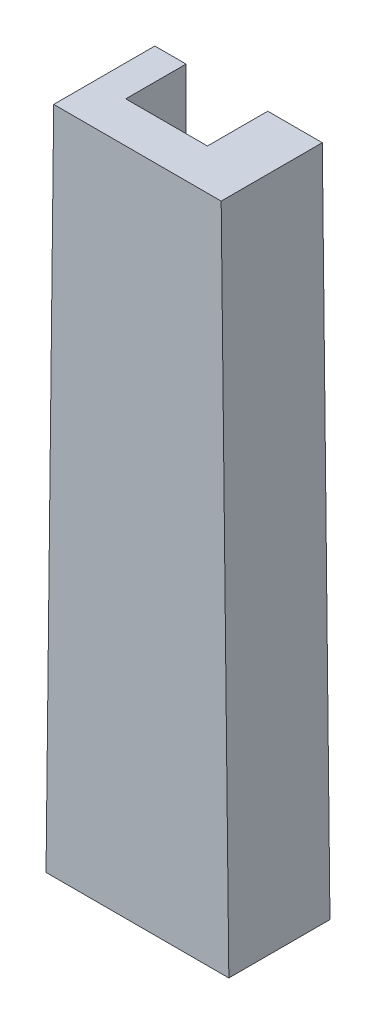
ISO-10303-21;
HEADER;
FILE_DESCRIPTION(('STEP AP214'),'2;1');
FILE_NAME('part.step','',(''),(''),'','','');
FILE_SCHEMA(('AUTOMOTIVE_DESIGN { 1 0 10303 214 1 1 1 1 }'));
ENDSEC;
DATA;
#1=APPLICATION_CONTEXT('core data for automotive mechanical design processes');
#2=APPLICATION_PROTOCOL_DEFINITION('international standard','automotive_design',2000,#1);
#3=PRODUCT_CONTEXT('',#1,'mechanical');
#4=PRODUCT('Part','Part','',(#3));
#5=PRODUCT_RELATED_PRODUCT_CATEGORY('part','',(#4));
#6=PRODUCT_DEFINITION_FORMATION('','',#4);
#7=PRODUCT_DEFINITION_CONTEXT('part definition',#1,'design');
#8=PRODUCT_DEFINITION('design','',#6,#7);
#9=PRODUCT_DEFINITION_SHAPE('','',#8);
#10=(LENGTH_UNIT() NAMED_UNIT(*) SI_UNIT(.MILLI.,.METRE.));
#11=(NAMED_UNIT(*) PLANE_ANGLE_UNIT() SI_UNIT($,.RADIAN.));
#12=(NAMED_UNIT(*) SI_UNIT($,.STERADIAN.) SOLID_ANGLE_UNIT());
#13=UNCERTAINTY_MEASURE_WITH_UNIT(LENGTH_MEASURE(1.E-05),#10,'distance_accuracy_value','');
#14=(GEOMETRIC_REPRESENTATION_CONTEXT(3) GLOBAL_UNCERTAINTY_ASSIGNED_CONTEXT((#13)) GLOBAL_UNIT_ASSIGNED_CONTEXT((#10,
#11,#12)) REPRESENTATION_CONTEXT('',''));
#15=CARTESIAN_POINT('',(0.,0.,0.));
#16=DIRECTION('',(0.,0.,1.));
#17=DIRECTION('',(1.,0.,0.));
#18=AXIS2_PLACEMENT_3D('',#15,#16,#17);
#19=CARTESIAN_POINT('',(0.,86.,0.));
#20=DIRECTION('',(0.,-1.,0.));
#21=DIRECTION('',(0.,0.,-1.));
#22=AXIS2_PLACEMENT_3D('',#19,#20,#21);
#23=PLANE('',#22);
#24=DIRECTION('',(-1.,0.,0.));
#25=VECTOR('',#24,1.);
#26=CARTESIAN_POINT('',(-10.9033495145631,86.,-0.383495145631064));
#27=LINE('',#26,#25);
#28=CARTESIAN_POINT('',(10.6266504854369,86.,-0.383495145631066));
#29=VERTEX_POINT('',#28);
#30=CARTESIAN_POINT('',(3.61165048543689,86.,-0.383495145631066));
#31=VERTEX_POINT('',#30);
#32=EDGE_CURVE('E47',#29,#31,#27,.T.);
#33=ORIENTED_EDGE('',*,*,#32,.T.);
#34=DIRECTION('',(0.,0.,-1.));
#35=VECTOR('',#34,1.);
#36=CARTESIAN_POINT('',(3.61165048543689,86.,7.36926663340781));
#37=LINE('',#36,#35);
#38=CARTESIAN_POINT('',(3.61165048543689,86.,7.36926663340781));
#39=VERTEX_POINT('',#38);
#40=EDGE_CURVE('E127',#39,#31,#37,.T.);
#41=ORIENTED_EDGE('',*,*,#40,.F.);
#42=DIRECTION('',(1.,0.,0.));
#43=VECTOR('',#42,1.);
#44=CARTESIAN_POINT('',(-6.88834951456311,86.,7.36926663340781));
#45=LINE('',#44,#43);
#46=CARTESIAN_POINT('',(-6.88834951456311,86.,7.36926663340781));
#47=VERTEX_POINT('',#46);
#48=EDGE_CURVE('E145',#47,#39,#45,.T.);
#49=ORIENTED_EDGE('',*,*,#48,.F.);
#50=DIRECTION('',(0.,0.,1.));
#51=VECTOR('',#50,1.);
#52=CARTESIAN_POINT('',(-6.88834951456311,86.,-0.383495145631066));
#53=LINE('',#52,#51);
#54=CARTESIAN_POINT('',(-6.88834951456311,86.,-0.383495145631066));
#55=VERTEX_POINT('',#54);
#56=EDGE_CURVE('E143',#55,#47,#53,.T.);
#57=ORIENTED_EDGE('',*,*,#56,.F.);
#58=CARTESIAN_POINT('',(-10.9033495145631,86.,-0.383495145631064));
#59=VERTEX_POINT('',#58);
#60=EDGE_CURVE('E132',#55,#59,#27,.T.);
#61=ORIENTED_EDGE('',*,*,#60,.T.);
#62=DIRECTION('',(0.,0.,1.));
#63=VECTOR('',#62,1.);
#64=CARTESIAN_POINT('',(-10.9033495145631,86.,12.6165048543689));
#65=LINE('',#64,#63);
#66=CARTESIAN_POINT('',(-10.9033495145631,86.,12.6165048543689));
#67=VERTEX_POINT('',#66);
#68=EDGE_CURVE('E149',#59,#67,#65,.T.);
#69=ORIENTED_EDGE('',*,*,#68,.T.);
#70=DIRECTION('',(1.,0.,0.));
#71=VECTOR('',#70,1.);
#72=CARTESIAN_POINT('',(10.6266504854369,86.,12.6165048543689));
#73=LINE('',#72,#71);
#74=CARTESIAN_POINT('',(10.6266504854369,86.,12.6165048543689));
#75=VERTEX_POINT('',#74);
#76=EDGE_CURVE('E169',#67,#75,#73,.T.);
#77=ORIENTED_EDGE('',*,*,#76,.T.);
#78=DIRECTION('',(0.,0.,-1.));
#79=VECTOR('',#78,1.);
#80=CARTESIAN_POINT('',(10.6266504854369,86.,-0.383495145631066));
#81=LINE('',#80,#79);
#82=EDGE_CURVE('E12',#75,#29,#81,.T.);
#83=ORIENTED_EDGE('',*,*,#82,.T.);
#84=EDGE_LOOP('',(#33,#41,#49,#57,#61,#69,#77,#83));
#85=FACE_BOUND('',#84,.T.);
#86=ADVANCED_FACE('F43',(#85),#23,.F.);
#87=CARTESIAN_POINT('',(0.,0.,0.));
#88=DIRECTION('',(0.,1.,0.));
#89=DIRECTION('',(0.,0.,1.));
#90=AXIS2_PLACEMENT_3D('',#87,#88,#89);
#91=PLANE('',#90);
#92=DIRECTION('',(0.,0.,1.));
#93=VECTOR('',#92,1.);
#94=CARTESIAN_POINT('',(-11.8883495145631,0.,-0.383495145631062));
#95=LINE('',#94,#93);
#96=CARTESIAN_POINT('',(-11.8883495145631,0.,-0.383495145631062));
#97=VERTEX_POINT('',#96);
#98=CARTESIAN_POINT('',(-11.8883495145631,0.,12.6165048543689));
#99=VERTEX_POINT('',#98);
#100=EDGE_CURVE('E208',#97,#99,#95,.T.);
#101=ORIENTED_EDGE('',*,*,#100,.F.);
#102=DIRECTION('',(-1.,0.,0.));
#103=VECTOR('',#102,1.);
#104=CARTESIAN_POINT('',(11.6116504854369,0.,-0.383495145631064));
#105=LINE('',#104,#103);
#106=CARTESIAN_POINT('',(11.6116504854369,0.,-0.383495145631064));
#107=VERTEX_POINT('',#106);
#108=EDGE_CURVE('E252',#107,#97,#105,.T.);
#109=ORIENTED_EDGE('',*,*,#108,.F.);
#110=DIRECTION('',(0.,0.,-1.));
#111=VECTOR('',#110,1.);
#112=CARTESIAN_POINT('',(11.6116504854369,0.,12.6165048543689));
#113=LINE('',#112,#111);
#114=CARTESIAN_POINT('',(11.6116504854369,0.,12.6165048543689));
#115=VERTEX_POINT('',#114);
#116=EDGE_CURVE('E188',#115,#107,#113,.T.);
#117=ORIENTED_EDGE('',*,*,#116,.F.);
#118=DIRECTION('',(1.,0.,0.));
#119=VECTOR('',#118,1.);
#120=CARTESIAN_POINT('',(-11.8883495145631,0.,12.6165048543689));
#121=LINE('',#120,#119);
#122=EDGE_CURVE('E285',#99,#115,#121,.T.);
#123=ORIENTED_EDGE('',*,*,#122,.F.);
#124=EDGE_LOOP('',(#101,#109,#117,#123));
#125=FACE_BOUND('',#124,.T.);
#126=ADVANCED_FACE('F264',(#125),#91,.F.);
#127=CARTESIAN_POINT('',(0.,0.,12.6165048543689));
#128=DIRECTION('',(0.,0.,-1.));
#129=DIRECTION('',(-1.,0.,0.));
#130=AXIS2_PLACEMENT_3D('',#127,#128,#129);
#131=PLANE('',#130);
#132=DIRECTION('',(-0.0114527371979749,0.999934415254658,0.));
#133=VECTOR('',#132,1.);
#134=CARTESIAN_POINT('',(11.6116504854369,0.,12.6165048543689));
#135=LINE('',#134,#133);
#136=EDGE_CURVE('E68',#115,#75,#135,.T.);
#137=ORIENTED_EDGE('',*,*,#136,.T.);
#138=ORIENTED_EDGE('',*,*,#76,.F.);
#139=DIRECTION('',(0.0114527371979749,0.999934415254658,0.));
#140=VECTOR('',#139,1.);
#141=CARTESIAN_POINT('',(-11.8883495145631,0.,12.6165048543689));
#142=LINE('',#141,#140);
#143=EDGE_CURVE('E190',#99,#67,#142,.T.);
#144=ORIENTED_EDGE('',*,*,#143,.F.);
#145=ORIENTED_EDGE('',*,*,#122,.T.);
#146=EDGE_LOOP('',(#137,#138,#144,#145));
#147=FACE_BOUND('',#146,.T.);
#148=ADVANCED_FACE('F224',(#147),#131,.F.);
#149=CARTESIAN_POINT('',(-11.8867901769483,0.136145213073187,0.));
#150=DIRECTION('',(0.999934415254658,-0.0114527371979749,0.));
#151=DIRECTION('',(0.0114527371979749,0.999934415254658,0.));
#152=AXIS2_PLACEMENT_3D('',#149,#150,#151);
#153=PLANE('',#152);
#154=ORIENTED_EDGE('',*,*,#143,.T.);
#155=ORIENTED_EDGE('',*,*,#68,.F.);
#156=DIRECTION('',(0.0114527371979749,0.999934415254658,0.));
#157=VECTOR('',#156,1.);
#158=CARTESIAN_POINT('',(-11.8883495145631,0.,-0.383495145631062));
#159=LINE('',#158,#157);
#160=EDGE_CURVE('E172',#97,#59,#159,.T.);
#161=ORIENTED_EDGE('',*,*,#160,.F.);
#162=ORIENTED_EDGE('',*,*,#100,.T.);
#163=EDGE_LOOP('',(#154,#155,#161,#162));
#164=FACE_BOUND('',#163,.T.);
#165=ADVANCED_FACE('F214',(#164),#153,.F.);
#166=CARTESIAN_POINT('',(11.6101274411026,0.132976459645186,0.));
#167=DIRECTION('',(-0.999934415254658,-0.0114527371979749,0.));
#168=DIRECTION('',(0.0114527371979749,-0.999934415254658,0.));
#169=AXIS2_PLACEMENT_3D('',#166,#167,#168);
#170=PLANE('',#169);
#171=DIRECTION('',(-0.0114527371979749,0.999934415254658,0.));
#172=VECTOR('',#171,1.);
#173=CARTESIAN_POINT('',(11.6116504854369,0.,-0.383495145631064));
#174=LINE('',#173,#172);
#175=EDGE_CURVE('E184',#107,#29,#174,.T.);
#176=ORIENTED_EDGE('',*,*,#175,.T.);
#177=ORIENTED_EDGE('',*,*,#82,.F.);
#178=ORIENTED_EDGE('',*,*,#136,.F.);
#179=ORIENTED_EDGE('',*,*,#116,.T.);
#180=EDGE_LOOP('',(#176,#177,#178,#179));
#181=FACE_BOUND('',#180,.T.);
#182=ADVANCED_FACE('F187',(#181),#170,.F.);
#183=CARTESIAN_POINT('',(0.,0.,-0.383495145631064));
#184=DIRECTION('',(0.,0.,1.));
#185=DIRECTION('',(1.,0.,0.));
#186=AXIS2_PLACEMENT_3D('',#183,#184,#185);
#187=PLANE('',#186);
#188=DIRECTION('',(-1.,0.,0.));
#189=VECTOR('',#188,1.);
#190=CARTESIAN_POINT('',(3.61165048543689,2.99999999999999,-0.383495145631066));
#191=LINE('',#190,#189);
#192=CARTESIAN_POINT('',(3.61165048543689,2.99999999999999,-0.383495145631064));
#193=VERTEX_POINT('',#192);
#194=CARTESIAN_POINT('',(-6.88834951456311,2.99999999999999,-0.383495145631066));
#195=VERTEX_POINT('',#194);
#196=EDGE_CURVE('E121',#193,#195,#191,.T.);
#197=ORIENTED_EDGE('',*,*,#196,.F.);
#198=DIRECTION('',(0.,1.,0.));
#199=VECTOR('',#198,1.);
#200=CARTESIAN_POINT('',(3.61165048543689,2.99999999999999,-0.383495145631066));
#201=LINE('',#200,#199);
#202=EDGE_CURVE('E150',#193,#31,#201,.T.);
#203=ORIENTED_EDGE('',*,*,#202,.T.);
#204=ORIENTED_EDGE('',*,*,#32,.F.);
#205=ORIENTED_EDGE('',*,*,#175,.F.);
#206=ORIENTED_EDGE('',*,*,#108,.T.);
#207=ORIENTED_EDGE('',*,*,#160,.T.);
#208=ORIENTED_EDGE('',*,*,#60,.F.);
#209=DIRECTION('',(0.,1.,0.));
#210=VECTOR('',#209,1.);
#211=CARTESIAN_POINT('',(-6.88834951456311,2.99999999999999,-0.383495145631066));
#212=LINE('',#211,#210);
#213=EDGE_CURVE('E116',#195,#55,#212,.T.);
#214=ORIENTED_EDGE('',*,*,#213,.F.);
#215=EDGE_LOOP('',(#197,#203,#204,#205,#206,#207,#208,#214));
#216=FACE_BOUND('',#215,.T.);
#217=ADVANCED_FACE('F130',(#216),#187,.F.);
#218=CARTESIAN_POINT('',(3.61165048543689,2.99999999999999,7.36926663340781));
#219=DIRECTION('',(1.,0.,0.));
#220=DIRECTION('',(0.,0.,-1.));
#221=AXIS2_PLACEMENT_3D('',#218,#219,#220);
#222=PLANE('',#221);
#223=ORIENTED_EDGE('',*,*,#40,.T.);
#224=ORIENTED_EDGE('',*,*,#202,.F.);
#225=DIRECTION('',(0.,0.,-1.));
#226=VECTOR('',#225,1.);
#227=CARTESIAN_POINT('',(3.61165048543689,2.99999999999999,7.36926663340781));
#228=LINE('',#227,#226);
#229=CARTESIAN_POINT('',(3.61165048543689,2.99999999999999,7.36926663340781));
#230=VERTEX_POINT('',#229);
#231=EDGE_CURVE('E60',#230,#193,#228,.T.);
#232=ORIENTED_EDGE('',*,*,#231,.F.);
#233=DIRECTION('',(0.,1.,0.));
#234=VECTOR('',#233,1.);
#235=CARTESIAN_POINT('',(3.61165048543689,2.99999999999999,7.36926663340781));
#236=LINE('',#235,#234);
#237=EDGE_CURVE('E135',#230,#39,#236,.T.);
#238=ORIENTED_EDGE('',*,*,#237,.T.);
#239=EDGE_LOOP('',(#223,#224,#232,#238));
#240=FACE_BOUND('',#239,.T.);
#241=ADVANCED_FACE('F323',(#240),#222,.F.);
#242=CARTESIAN_POINT('',(-6.88834951456311,2.99999999999999,7.36926663340781));
#243=DIRECTION('',(0.,0.,1.));
#244=DIRECTION('',(1.,0.,0.));
#245=AXIS2_PLACEMENT_3D('',#242,#243,#244);
#246=PLANE('',#245);
#247=ORIENTED_EDGE('',*,*,#48,.T.);
#248=ORIENTED_EDGE('',*,*,#237,.F.);
#249=DIRECTION('',(1.,0.,0.));
#250=VECTOR('',#249,1.);
#251=CARTESIAN_POINT('',(-6.88834951456311,2.99999999999999,7.36926663340781));
#252=LINE('',#251,#250);
#253=CARTESIAN_POINT('',(-6.88834951456311,2.99999999999999,7.36926663340781));
#254=VERTEX_POINT('',#253);
#255=EDGE_CURVE('E120',#254,#230,#252,.T.);
#256=ORIENTED_EDGE('',*,*,#255,.F.);
#257=DIRECTION('',(0.,1.,0.));
#258=VECTOR('',#257,1.);
#259=CARTESIAN_POINT('',(-6.88834951456311,2.99999999999999,7.36926663340781));
#260=LINE('',#259,#258);
#261=EDGE_CURVE('E118',#254,#47,#260,.T.);
#262=ORIENTED_EDGE('',*,*,#261,.T.);
#263=EDGE_LOOP('',(#247,#248,#256,#262));
#264=FACE_BOUND('',#263,.T.);
#265=ADVANCED_FACE('F325',(#264),#246,.F.);
#266=CARTESIAN_POINT('',(-6.88834951456311,2.99999999999999,-0.383495145631066));
#267=DIRECTION('',(-1.,0.,0.));
#268=DIRECTION('',(0.,0.,1.));
#269=AXIS2_PLACEMENT_3D('',#266,#267,#268);
#270=PLANE('',#269);
#271=ORIENTED_EDGE('',*,*,#56,.T.);
#272=ORIENTED_EDGE('',*,*,#261,.F.);
#273=DIRECTION('',(0.,0.,1.));
#274=VECTOR('',#273,1.);
#275=CARTESIAN_POINT('',(-6.88834951456311,2.99999999999999,-0.383495145631066));
#276=LINE('',#275,#274);
#277=EDGE_CURVE('E112',#195,#254,#276,.T.);
#278=ORIENTED_EDGE('',*,*,#277,.F.);
#279=ORIENTED_EDGE('',*,*,#213,.T.);
#280=EDGE_LOOP('',(#271,#272,#278,#279));
#281=FACE_BOUND('',#280,.T.);
#282=ADVANCED_FACE('F114',(#281),#270,.F.);
#283=CARTESIAN_POINT('',(0.,2.99999999999999,0.));
#284=DIRECTION('',(0.,1.,0.));
#285=DIRECTION('',(0.,0.,1.));
#286=AXIS2_PLACEMENT_3D('',#283,#284,#285);
#287=PLANE('',#286);
#288=ORIENTED_EDGE('',*,*,#196,.T.);
#289=ORIENTED_EDGE('',*,*,#277,.T.);
#290=ORIENTED_EDGE('',*,*,#255,.T.);
#291=ORIENTED_EDGE('',*,*,#231,.T.);
#292=EDGE_LOOP('',(#288,#289,#290,#291));
#293=FACE_BOUND('',#292,.T.);
#294=ADVANCED_FACE('F124',(#293),#287,.T.);
#295=CLOSED_SHELL('',(#86,#126,#148,#165,#182,#217,#241,#265,#282,#294));
#296=MANIFOLD_SOLID_BREP('B2',#295);
#297=ADVANCED_BREP_SHAPE_REPRESENTATION('',(#18,#296),#14);
#298=SHAPE_DEFINITION_REPRESENTATION(#9,#297);
ENDSEC;
END-ISO-10303-21;
